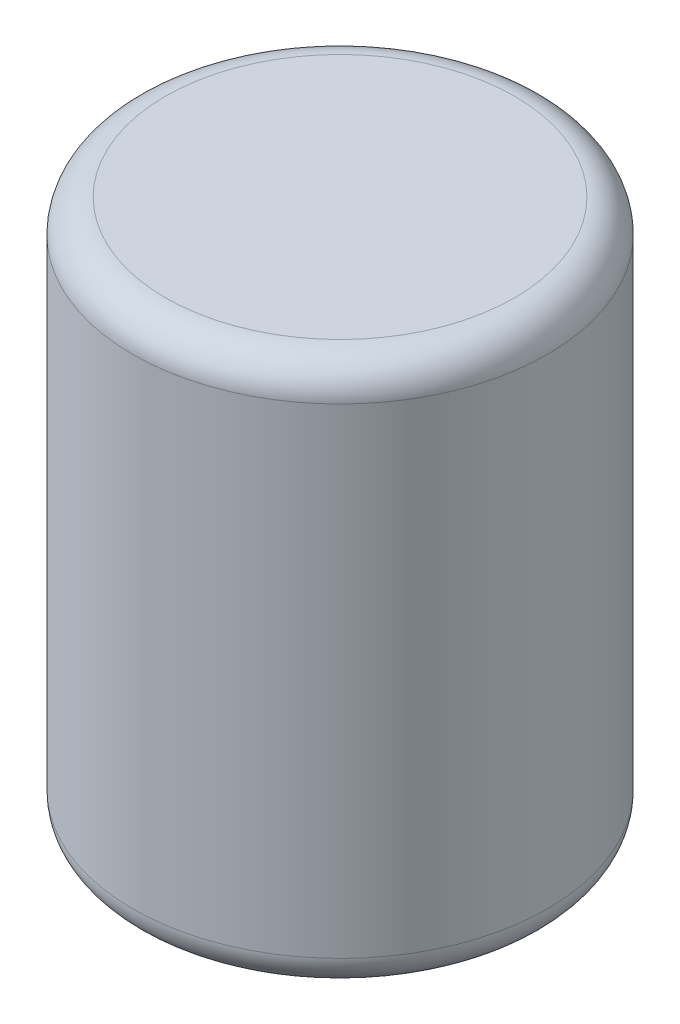
ISO-10303-21;
HEADER;
FILE_DESCRIPTION(('STEP AP214'),'2;1');
FILE_NAME('part.step','',(''),(''),'','','');
FILE_SCHEMA(('AUTOMOTIVE_DESIGN { 1 0 10303 214 1 1 1 1 }'));
ENDSEC;
DATA;
#1=APPLICATION_CONTEXT('core data for automotive mechanical design processes');
#2=APPLICATION_PROTOCOL_DEFINITION('international standard','automotive_design',2000,#1);
#3=PRODUCT_CONTEXT('',#1,'mechanical');
#4=PRODUCT('Part','Part','',(#3));
#5=PRODUCT_RELATED_PRODUCT_CATEGORY('part','',(#4));
#6=PRODUCT_DEFINITION_FORMATION('','',#4);
#7=PRODUCT_DEFINITION_CONTEXT('part definition',#1,'design');
#8=PRODUCT_DEFINITION('design','',#6,#7);
#9=PRODUCT_DEFINITION_SHAPE('','',#8);
#10=(LENGTH_UNIT() NAMED_UNIT(*) SI_UNIT(.MILLI.,.METRE.));
#11=(NAMED_UNIT(*) PLANE_ANGLE_UNIT() SI_UNIT($,.RADIAN.));
#12=(NAMED_UNIT(*) SI_UNIT($,.STERADIAN.) SOLID_ANGLE_UNIT());
#13=UNCERTAINTY_MEASURE_WITH_UNIT(LENGTH_MEASURE(1.E-05),#10,'distance_accuracy_value','');
#14=(GEOMETRIC_REPRESENTATION_CONTEXT(3) GLOBAL_UNCERTAINTY_ASSIGNED_CONTEXT((#13)) GLOBAL_UNIT_ASSIGNED_CONTEXT((#10,
#11,#12)) REPRESENTATION_CONTEXT('',''));
#15=CARTESIAN_POINT('',(0.,0.,0.));
#16=DIRECTION('',(0.,0.,1.));
#17=DIRECTION('',(1.,0.,0.));
#18=AXIS2_PLACEMENT_3D('',#15,#16,#17);
#19=CARTESIAN_POINT('',(0.,25.,0.));
#20=DIRECTION('',(0.,-1.,0.));
#21=DIRECTION('',(0.,0.,-1.));
#22=AXIS2_PLACEMENT_3D('',#19,#20,#21);
#23=CYLINDRICAL_SURFACE('',#22,9.5);
#24=CARTESIAN_POINT('',(0.,1.5,0.));
#25=DIRECTION('',(0.,1.,0.));
#26=DIRECTION('',(0.,0.,1.));
#27=AXIS2_PLACEMENT_3D('',#24,#25,#26);
#28=CIRCLE('',#27,9.5);
#29=CARTESIAN_POINT('',(0.,1.5,9.5));
#30=VERTEX_POINT('',#29);
#31=EDGE_CURVE('E44',#30,#30,#28,.T.);
#32=ORIENTED_EDGE('',*,*,#31,.T.);
#33=EDGE_LOOP('',(#32));
#34=FACE_BOUND('',#33,.T.);
#35=CARTESIAN_POINT('',(0.,23.5,0.));
#36=DIRECTION('',(0.,1.,0.));
#37=DIRECTION('',(0.,0.,1.));
#38=AXIS2_PLACEMENT_3D('',#35,#36,#37);
#39=CIRCLE('',#38,9.5);
#40=CARTESIAN_POINT('',(0.,23.5,9.5));
#41=VERTEX_POINT('',#40);
#42=EDGE_CURVE('E48',#41,#41,#39,.F.);
#43=ORIENTED_EDGE('',*,*,#42,.T.);
#44=EDGE_LOOP('',(#43));
#45=FACE_BOUND('',#44,.T.);
#46=ADVANCED_FACE('F33',(#34,#45),#23,.T.);
#47=CARTESIAN_POINT('',(0.,25.,0.));
#48=DIRECTION('',(0.,1.,0.));
#49=DIRECTION('',(0.,0.,1.));
#50=AXIS2_PLACEMENT_3D('',#47,#48,#49);
#51=PLANE('',#50);
#52=CARTESIAN_POINT('',(0.,25.,0.));
#53=DIRECTION('',(0.,1.,0.));
#54=DIRECTION('',(0.,0.,1.));
#55=AXIS2_PLACEMENT_3D('',#52,#53,#54);
#56=CIRCLE('',#55,8.);
#57=CARTESIAN_POINT('',(0.,25.,8.));
#58=VERTEX_POINT('',#57);
#59=EDGE_CURVE('E10',#58,#58,#56,.T.);
#60=ORIENTED_EDGE('',*,*,#59,.T.);
#61=EDGE_LOOP('',(#60));
#62=FACE_BOUND('',#61,.T.);
#63=ADVANCED_FACE('F64',(#62),#51,.T.);
#64=CARTESIAN_POINT('',(0.,0.,0.));
#65=DIRECTION('',(0.,1.,0.));
#66=DIRECTION('',(0.,0.,1.));
#67=AXIS2_PLACEMENT_3D('',#64,#65,#66);
#68=PLANE('',#67);
#69=CARTESIAN_POINT('',(0.,0.,0.));
#70=DIRECTION('',(0.,1.,0.));
#71=DIRECTION('',(0.,0.,1.));
#72=AXIS2_PLACEMENT_3D('',#69,#70,#71);
#73=CIRCLE('',#72,8.);
#74=CARTESIAN_POINT('',(0.,0.,8.));
#75=VERTEX_POINT('',#74);
#76=EDGE_CURVE('E40',#75,#75,#73,.F.);
#77=ORIENTED_EDGE('',*,*,#76,.T.);
#78=EDGE_LOOP('',(#77));
#79=FACE_BOUND('',#78,.T.);
#80=ADVANCED_FACE('F61',(#79),#68,.F.);
#81=CARTESIAN_POINT('',(0.,1.5,0.));
#82=DIRECTION('',(0.,1.,0.));
#83=DIRECTION('',(0.,0.,1.));
#84=AXIS2_PLACEMENT_3D('',#81,#82,#83);
#85=TOROIDAL_SURFACE('',#84,8.,1.5);
#86=ORIENTED_EDGE('',*,*,#76,.F.);
#87=EDGE_LOOP('',(#86));
#88=FACE_BOUND('',#87,.T.);
#89=ORIENTED_EDGE('',*,*,#31,.F.);
#90=EDGE_LOOP('',(#89));
#91=FACE_BOUND('',#90,.T.);
#92=ADVANCED_FACE('F57',(#88,#91),#85,.T.);
#93=CARTESIAN_POINT('',(0.,23.5,0.));
#94=DIRECTION('',(0.,1.,0.));
#95=DIRECTION('',(0.,0.,1.));
#96=AXIS2_PLACEMENT_3D('',#93,#94,#95);
#97=TOROIDAL_SURFACE('',#96,8.,1.5);
#98=ORIENTED_EDGE('',*,*,#42,.F.);
#99=EDGE_LOOP('',(#98));
#100=FACE_BOUND('',#99,.T.);
#101=ORIENTED_EDGE('',*,*,#59,.F.);
#102=EDGE_LOOP('',(#101));
#103=FACE_BOUND('',#102,.T.);
#104=ADVANCED_FACE('F35',(#100,#103),#97,.T.);
#105=CLOSED_SHELL('',(#46,#63,#80,#92,#104));
#106=MANIFOLD_SOLID_BREP('B2',#105);
#107=ADVANCED_BREP_SHAPE_REPRESENTATION('',(#18,#106),#14);
#108=SHAPE_DEFINITION_REPRESENTATION(#9,#107);
ENDSEC;
END-ISO-10303-21;
